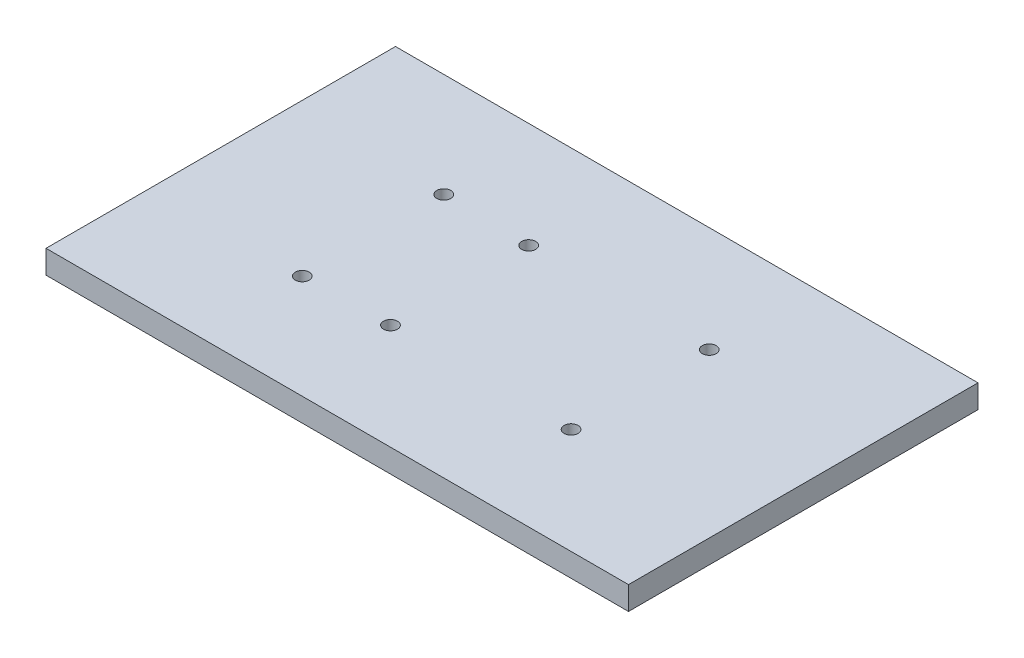
ISO-10303-21;
HEADER;
FILE_DESCRIPTION(('STEP AP214'),'2;1');
FILE_NAME('part.step','',(''),(''),'','','');
FILE_SCHEMA(('AUTOMOTIVE_DESIGN { 1 0 10303 214 1 1 1 1 }'));
ENDSEC;
DATA;
#1=APPLICATION_CONTEXT('core data for automotive mechanical design processes');
#2=APPLICATION_PROTOCOL_DEFINITION('international standard','automotive_design',2000,#1);
#3=PRODUCT_CONTEXT('',#1,'mechanical');
#4=PRODUCT('Part','Part','',(#3));
#5=PRODUCT_RELATED_PRODUCT_CATEGORY('part','',(#4));
#6=PRODUCT_DEFINITION_FORMATION('','',#4);
#7=PRODUCT_DEFINITION_CONTEXT('part definition',#1,'design');
#8=PRODUCT_DEFINITION('design','',#6,#7);
#9=PRODUCT_DEFINITION_SHAPE('','',#8);
#10=(LENGTH_UNIT() NAMED_UNIT(*) SI_UNIT(.MILLI.,.METRE.));
#11=(NAMED_UNIT(*) PLANE_ANGLE_UNIT() SI_UNIT($,.RADIAN.));
#12=(NAMED_UNIT(*) SI_UNIT($,.STERADIAN.) SOLID_ANGLE_UNIT());
#13=UNCERTAINTY_MEASURE_WITH_UNIT(LENGTH_MEASURE(1.E-05),#10,'distance_accuracy_value','');
#14=(GEOMETRIC_REPRESENTATION_CONTEXT(3) GLOBAL_UNCERTAINTY_ASSIGNED_CONTEXT((#13)) GLOBAL_UNIT_ASSIGNED_CONTEXT((#10,
#11,#12)) REPRESENTATION_CONTEXT('',''));
#15=CARTESIAN_POINT('',(0.,0.,0.));
#16=DIRECTION('',(0.,0.,1.));
#17=DIRECTION('',(1.,0.,0.));
#18=AXIS2_PLACEMENT_3D('',#15,#16,#17);
#19=CARTESIAN_POINT('',(0.,5.08,0.));
#20=DIRECTION('',(0.,1.,0.));
#21=DIRECTION('',(0.,0.,1.));
#22=AXIS2_PLACEMENT_3D('',#19,#20,#21);
#23=PLANE('',#22);
#24=DIRECTION('',(1.,0.,0.));
#25=VECTOR('',#24,1.);
#26=CARTESIAN_POINT('',(-63.5,5.08,-38.1));
#27=LINE('',#26,#25);
#28=CARTESIAN_POINT('',(-63.5,5.08,-38.1));
#29=VERTEX_POINT('',#28);
#30=CARTESIAN_POINT('',(63.5,5.08,-38.1));
#31=VERTEX_POINT('',#30);
#32=EDGE_CURVE('E95',#29,#31,#27,.T.);
#33=ORIENTED_EDGE('',*,*,#32,.F.);
#34=DIRECTION('',(0.,0.,-1.));
#35=VECTOR('',#34,1.);
#36=CARTESIAN_POINT('',(-63.5,5.08,38.1));
#37=LINE('',#36,#35);
#38=CARTESIAN_POINT('',(-63.5,5.08,38.1));
#39=VERTEX_POINT('',#38);
#40=EDGE_CURVE('E83',#39,#29,#37,.T.);
#41=ORIENTED_EDGE('',*,*,#40,.F.);
#42=DIRECTION('',(1.,0.,0.));
#43=VECTOR('',#42,1.);
#44=CARTESIAN_POINT('',(-63.5,5.08,38.1));
#45=LINE('',#44,#43);
#46=CARTESIAN_POINT('',(63.5,5.08,38.1));
#47=VERTEX_POINT('',#46);
#48=EDGE_CURVE('E80',#39,#47,#45,.T.);
#49=ORIENTED_EDGE('',*,*,#48,.T.);
#50=DIRECTION('',(0.,0.,-1.));
#51=VECTOR('',#50,1.);
#52=CARTESIAN_POINT('',(63.5,5.08,38.1));
#53=LINE('',#52,#51);
#54=EDGE_CURVE('E77',#47,#31,#53,.T.);
#55=ORIENTED_EDGE('',*,*,#54,.T.);
#56=EDGE_LOOP('',(#33,#41,#49,#55));
#57=FACE_BOUND('',#56,.T.);
#58=CARTESIAN_POINT('',(27.94,5.08,-15.0622));
#59=DIRECTION('',(0.,1.,0.));
#60=DIRECTION('',(0.,0.,1.));
#61=AXIS2_PLACEMENT_3D('',#58,#59,#60);
#62=CIRCLE('',#61,1.524);
#63=CARTESIAN_POINT('',(27.94,5.08,-13.5382));
#64=VERTEX_POINT('',#63);
#65=EDGE_CURVE('E106',#64,#64,#62,.T.);
#66=ORIENTED_EDGE('',*,*,#65,.F.);
#67=EDGE_LOOP('',(#66));
#68=FACE_BOUND('',#67,.T.);
#69=CARTESIAN_POINT('',(-30.3022,5.08,-15.4263161575946));
#70=DIRECTION('',(0.,1.,0.));
#71=DIRECTION('',(0.,0.,1.));
#72=AXIS2_PLACEMENT_3D('',#69,#70,#71);
#73=CIRCLE('',#72,1.524);
#74=CARTESIAN_POINT('',(-30.3022,5.08,-13.9023161575946));
#75=VERTEX_POINT('',#74);
#76=EDGE_CURVE('E205',#75,#75,#73,.T.);
#77=ORIENTED_EDGE('',*,*,#76,.F.);
#78=EDGE_LOOP('',(#77));
#79=FACE_BOUND('',#78,.T.);
#80=CARTESIAN_POINT('',(27.94,5.08,15.0622));
#81=DIRECTION('',(0.,1.,0.));
#82=DIRECTION('',(0.,0.,1.));
#83=AXIS2_PLACEMENT_3D('',#80,#81,#82);
#84=CIRCLE('',#83,1.524);
#85=CARTESIAN_POINT('',(27.94,5.08,16.5862));
#86=VERTEX_POINT('',#85);
#87=EDGE_CURVE('E216',#86,#86,#84,.T.);
#88=ORIENTED_EDGE('',*,*,#87,.F.);
#89=EDGE_LOOP('',(#88));
#90=FACE_BOUND('',#89,.T.);
#91=CARTESIAN_POINT('',(-11.43,5.08,-15.0622));
#92=DIRECTION('',(0.,1.,0.));
#93=DIRECTION('',(0.,0.,1.));
#94=AXIS2_PLACEMENT_3D('',#91,#92,#93);
#95=CIRCLE('',#94,1.524);
#96=CARTESIAN_POINT('',(-11.43,5.08,-13.5382));
#97=VERTEX_POINT('',#96);
#98=EDGE_CURVE('E214',#97,#97,#95,.T.);
#99=ORIENTED_EDGE('',*,*,#98,.F.);
#100=EDGE_LOOP('',(#99));
#101=FACE_BOUND('',#100,.T.);
#102=CARTESIAN_POINT('',(-11.43,5.08,15.0622));
#103=DIRECTION('',(0.,1.,0.));
#104=DIRECTION('',(0.,0.,1.));
#105=AXIS2_PLACEMENT_3D('',#102,#103,#104);
#106=CIRCLE('',#105,1.524);
#107=CARTESIAN_POINT('',(-11.43,5.08,16.5862));
#108=VERTEX_POINT('',#107);
#109=EDGE_CURVE('E210',#108,#108,#106,.T.);
#110=ORIENTED_EDGE('',*,*,#109,.F.);
#111=EDGE_LOOP('',(#110));
#112=FACE_BOUND('',#111,.T.);
#113=CARTESIAN_POINT('',(-30.3022,5.08,15.4263161575946));
#114=DIRECTION('',(0.,-1.,0.));
#115=DIRECTION('',(0.,0.,-1.));
#116=AXIS2_PLACEMENT_3D('',#113,#114,#115);
#117=CIRCLE('',#116,1.524);
#118=CARTESIAN_POINT('',(-30.3022,5.08,13.9023161575946));
#119=VERTEX_POINT('',#118);
#120=EDGE_CURVE('E207',#119,#119,#117,.T.);
#121=ORIENTED_EDGE('',*,*,#120,.T.);
#122=EDGE_LOOP('',(#121));
#123=FACE_BOUND('',#122,.T.);
#124=ADVANCED_FACE('F33',(#57,#68,#79,#90,#101,#112,#123),#23,.T.);
#125=CARTESIAN_POINT('',(0.,0.,0.));
#126=DIRECTION('',(0.,1.,0.));
#127=DIRECTION('',(0.,0.,1.));
#128=AXIS2_PLACEMENT_3D('',#125,#126,#127);
#129=PLANE('',#128);
#130=CARTESIAN_POINT('',(-30.3022,0.,15.4263161575946));
#131=DIRECTION('',(0.,1.,0.));
#132=DIRECTION('',(0.,0.,1.));
#133=AXIS2_PLACEMENT_3D('',#130,#131,#132);
#134=CIRCLE('',#133,1.77800000000002);
#135=CARTESIAN_POINT('',(-30.3022,0.,17.2043161575947));
#136=VERTEX_POINT('',#135);
#137=EDGE_CURVE('E132',#136,#136,#134,.T.);
#138=ORIENTED_EDGE('',*,*,#137,.T.);
#139=EDGE_LOOP('',(#138));
#140=FACE_BOUND('',#139,.T.);
#141=CARTESIAN_POINT('',(-30.3022,0.,-15.4263161575946));
#142=DIRECTION('',(0.,1.,0.));
#143=DIRECTION('',(0.,0.,1.));
#144=AXIS2_PLACEMENT_3D('',#141,#142,#143);
#145=CIRCLE('',#144,1.778);
#146=CARTESIAN_POINT('',(-30.3022,0.,-13.6483161575946));
#147=VERTEX_POINT('',#146);
#148=EDGE_CURVE('E129',#147,#147,#145,.T.);
#149=ORIENTED_EDGE('',*,*,#148,.T.);
#150=EDGE_LOOP('',(#149));
#151=FACE_BOUND('',#150,.T.);
#152=CARTESIAN_POINT('',(-11.43,0.,-15.0622));
#153=DIRECTION('',(0.,1.,0.));
#154=DIRECTION('',(0.,0.,1.));
#155=AXIS2_PLACEMENT_3D('',#152,#153,#154);
#156=CIRCLE('',#155,1.77800000000003);
#157=CARTESIAN_POINT('',(-11.43,0.,-13.2842));
#158=VERTEX_POINT('',#157);
#159=EDGE_CURVE('E126',#158,#158,#156,.T.);
#160=ORIENTED_EDGE('',*,*,#159,.T.);
#161=EDGE_LOOP('',(#160));
#162=FACE_BOUND('',#161,.T.);
#163=CARTESIAN_POINT('',(-11.43,0.,15.0622));
#164=DIRECTION('',(0.,1.,0.));
#165=DIRECTION('',(0.,0.,1.));
#166=AXIS2_PLACEMENT_3D('',#163,#164,#165);
#167=CIRCLE('',#166,1.778);
#168=CARTESIAN_POINT('',(-11.43,0.,16.8402));
#169=VERTEX_POINT('',#168);
#170=EDGE_CURVE('E123',#169,#169,#167,.T.);
#171=ORIENTED_EDGE('',*,*,#170,.T.);
#172=EDGE_LOOP('',(#171));
#173=FACE_BOUND('',#172,.T.);
#174=CARTESIAN_POINT('',(27.94,0.,15.0622));
#175=DIRECTION('',(0.,1.,0.));
#176=DIRECTION('',(0.,0.,1.));
#177=AXIS2_PLACEMENT_3D('',#174,#175,#176);
#178=CIRCLE('',#177,1.77800000000005);
#179=CARTESIAN_POINT('',(27.94,0.,16.8402000000001));
#180=VERTEX_POINT('',#179);
#181=EDGE_CURVE('E120',#180,#180,#178,.T.);
#182=ORIENTED_EDGE('',*,*,#181,.T.);
#183=EDGE_LOOP('',(#182));
#184=FACE_BOUND('',#183,.T.);
#185=CARTESIAN_POINT('',(27.94,0.,-15.0622));
#186=DIRECTION('',(0.,1.,0.));
#187=DIRECTION('',(0.,0.,1.));
#188=AXIS2_PLACEMENT_3D('',#185,#186,#187);
#189=CIRCLE('',#188,1.778);
#190=CARTESIAN_POINT('',(27.94,0.,-13.2842));
#191=VERTEX_POINT('',#190);
#192=EDGE_CURVE('E117',#191,#191,#189,.T.);
#193=ORIENTED_EDGE('',*,*,#192,.T.);
#194=EDGE_LOOP('',(#193));
#195=FACE_BOUND('',#194,.T.);
#196=DIRECTION('',(1.,0.,0.));
#197=VECTOR('',#196,1.);
#198=CARTESIAN_POINT('',(-63.5,0.,-38.1));
#199=LINE('',#198,#197);
#200=CARTESIAN_POINT('',(-63.5,0.,-38.1));
#201=VERTEX_POINT('',#200);
#202=CARTESIAN_POINT('',(63.5,0.,-38.1));
#203=VERTEX_POINT('',#202);
#204=EDGE_CURVE('E102',#201,#203,#199,.T.);
#205=ORIENTED_EDGE('',*,*,#204,.T.);
#206=DIRECTION('',(0.,0.,-1.));
#207=VECTOR('',#206,1.);
#208=CARTESIAN_POINT('',(63.5,0.,38.1));
#209=LINE('',#208,#207);
#210=CARTESIAN_POINT('',(63.5,0.,38.1));
#211=VERTEX_POINT('',#210);
#212=EDGE_CURVE('E105',#211,#203,#209,.T.);
#213=ORIENTED_EDGE('',*,*,#212,.F.);
#214=DIRECTION('',(1.,0.,0.));
#215=VECTOR('',#214,1.);
#216=CARTESIAN_POINT('',(-63.5,0.,38.1));
#217=LINE('',#216,#215);
#218=CARTESIAN_POINT('',(-63.5,0.,38.1));
#219=VERTEX_POINT('',#218);
#220=EDGE_CURVE('E88',#219,#211,#217,.T.);
#221=ORIENTED_EDGE('',*,*,#220,.F.);
#222=DIRECTION('',(0.,0.,-1.));
#223=VECTOR('',#222,1.);
#224=CARTESIAN_POINT('',(-63.5,0.,38.1));
#225=LINE('',#224,#223);
#226=EDGE_CURVE('E97',#219,#201,#225,.T.);
#227=ORIENTED_EDGE('',*,*,#226,.T.);
#228=EDGE_LOOP('',(#205,#213,#221,#227));
#229=FACE_BOUND('',#228,.T.);
#230=ADVANCED_FACE('F155',(#140,#151,#162,#173,#184,#195,#229),#129,.F.);
#231=CARTESIAN_POINT('',(-63.5,5.08,-38.1));
#232=DIRECTION('',(0.,0.,-1.));
#233=DIRECTION('',(-1.,0.,0.));
#234=AXIS2_PLACEMENT_3D('',#231,#232,#233);
#235=PLANE('',#234);
#236=ORIENTED_EDGE('',*,*,#204,.F.);
#237=DIRECTION('',(0.,-1.,0.));
#238=VECTOR('',#237,1.);
#239=CARTESIAN_POINT('',(-63.5,5.08,-38.1));
#240=LINE('',#239,#238);
#241=EDGE_CURVE('E50',#29,#201,#240,.T.);
#242=ORIENTED_EDGE('',*,*,#241,.F.);
#243=ORIENTED_EDGE('',*,*,#32,.T.);
#244=DIRECTION('',(0.,-1.,0.));
#245=VECTOR('',#244,1.);
#246=CARTESIAN_POINT('',(63.5,5.08,-38.1));
#247=LINE('',#246,#245);
#248=EDGE_CURVE('E92',#31,#203,#247,.T.);
#249=ORIENTED_EDGE('',*,*,#248,.T.);
#250=EDGE_LOOP('',(#236,#242,#243,#249));
#251=FACE_BOUND('',#250,.T.);
#252=ADVANCED_FACE('F158',(#251),#235,.T.);
#253=CARTESIAN_POINT('',(-63.5,5.08,38.1));
#254=DIRECTION('',(-1.,0.,0.));
#255=DIRECTION('',(0.,0.,1.));
#256=AXIS2_PLACEMENT_3D('',#253,#254,#255);
#257=PLANE('',#256);
#258=ORIENTED_EDGE('',*,*,#226,.F.);
#259=DIRECTION('',(0.,-1.,0.));
#260=VECTOR('',#259,1.);
#261=CARTESIAN_POINT('',(-63.5,5.08,38.1));
#262=LINE('',#261,#260);
#263=EDGE_CURVE('E66',#39,#219,#262,.T.);
#264=ORIENTED_EDGE('',*,*,#263,.F.);
#265=ORIENTED_EDGE('',*,*,#40,.T.);
#266=ORIENTED_EDGE('',*,*,#241,.T.);
#267=EDGE_LOOP('',(#258,#264,#265,#266));
#268=FACE_BOUND('',#267,.T.);
#269=ADVANCED_FACE('F163',(#268),#257,.T.);
#270=CARTESIAN_POINT('',(-63.5,5.08,38.1));
#271=DIRECTION('',(0.,0.,-1.));
#272=DIRECTION('',(-1.,0.,0.));
#273=AXIS2_PLACEMENT_3D('',#270,#271,#272);
#274=PLANE('',#273);
#275=ORIENTED_EDGE('',*,*,#220,.T.);
#276=DIRECTION('',(0.,-1.,0.));
#277=VECTOR('',#276,1.);
#278=CARTESIAN_POINT('',(63.5,5.08,38.1));
#279=LINE('',#278,#277);
#280=EDGE_CURVE('E86',#47,#211,#279,.T.);
#281=ORIENTED_EDGE('',*,*,#280,.F.);
#282=ORIENTED_EDGE('',*,*,#48,.F.);
#283=ORIENTED_EDGE('',*,*,#263,.T.);
#284=EDGE_LOOP('',(#275,#281,#282,#283));
#285=FACE_BOUND('',#284,.T.);
#286=ADVANCED_FACE('F87',(#285),#274,.F.);
#287=CARTESIAN_POINT('',(63.5,5.08,38.1));
#288=DIRECTION('',(-1.,0.,0.));
#289=DIRECTION('',(0.,0.,1.));
#290=AXIS2_PLACEMENT_3D('',#287,#288,#289);
#291=PLANE('',#290);
#292=ORIENTED_EDGE('',*,*,#212,.T.);
#293=ORIENTED_EDGE('',*,*,#248,.F.);
#294=ORIENTED_EDGE('',*,*,#54,.F.);
#295=ORIENTED_EDGE('',*,*,#280,.T.);
#296=EDGE_LOOP('',(#292,#293,#294,#295));
#297=FACE_BOUND('',#296,.T.);
#298=ADVANCED_FACE('F94',(#297),#291,.F.);
#299=CARTESIAN_POINT('',(27.94,0.,-15.0622));
#300=DIRECTION('',(0.,1.,0.));
#301=DIRECTION('',(0.,0.,1.));
#302=AXIS2_PLACEMENT_3D('',#299,#300,#301);
#303=CYLINDRICAL_SURFACE('',#302,1.524);
#304=CARTESIAN_POINT('',(27.94,0.253999999999978,-15.0622));
#305=DIRECTION('',(0.,1.,0.));
#306=DIRECTION('',(0.,0.,1.));
#307=AXIS2_PLACEMENT_3D('',#304,#305,#306);
#308=CIRCLE('',#307,1.524);
#309=CARTESIAN_POINT('',(27.94,0.253999999999978,-13.5382));
#310=VERTEX_POINT('',#309);
#311=EDGE_CURVE('E11',#310,#310,#308,.F.);
#312=ORIENTED_EDGE('',*,*,#311,.T.);
#313=EDGE_LOOP('',(#312));
#314=FACE_BOUND('',#313,.T.);
#315=ORIENTED_EDGE('',*,*,#65,.T.);
#316=EDGE_LOOP('',(#315));
#317=FACE_BOUND('',#316,.T.);
#318=ADVANCED_FACE('F177',(#314,#317),#303,.F.);
#319=CARTESIAN_POINT('',(-30.3022,0.,-15.4263161575946));
#320=DIRECTION('',(0.,1.,0.));
#321=DIRECTION('',(0.,0.,1.));
#322=AXIS2_PLACEMENT_3D('',#319,#320,#321);
#323=CYLINDRICAL_SURFACE('',#322,1.524);
#324=CARTESIAN_POINT('',(-30.3022,0.253999999999977,-15.4263161575946));
#325=DIRECTION('',(0.,1.,0.));
#326=DIRECTION('',(0.,0.,1.));
#327=AXIS2_PLACEMENT_3D('',#324,#325,#326);
#328=CIRCLE('',#327,1.524);
#329=CARTESIAN_POINT('',(-30.3022,0.253999999999977,-13.9023161575946));
#330=VERTEX_POINT('',#329);
#331=EDGE_CURVE('E135',#330,#330,#328,.F.);
#332=ORIENTED_EDGE('',*,*,#331,.T.);
#333=EDGE_LOOP('',(#332));
#334=FACE_BOUND('',#333,.T.);
#335=ORIENTED_EDGE('',*,*,#76,.T.);
#336=EDGE_LOOP('',(#335));
#337=FACE_BOUND('',#336,.T.);
#338=ADVANCED_FACE('F180',(#334,#337),#323,.F.);
#339=CARTESIAN_POINT('',(27.94,0.,15.0622));
#340=DIRECTION('',(0.,1.,0.));
#341=DIRECTION('',(0.,0.,1.));
#342=AXIS2_PLACEMENT_3D('',#339,#340,#341);
#343=CYLINDRICAL_SURFACE('',#342,1.524);
#344=CARTESIAN_POINT('',(27.94,0.25400000000004,15.0622));
#345=DIRECTION('',(0.,1.,0.));
#346=DIRECTION('',(0.,0.,1.));
#347=AXIS2_PLACEMENT_3D('',#344,#345,#346);
#348=CIRCLE('',#347,1.524);
#349=CARTESIAN_POINT('',(27.94,0.25400000000004,16.5862));
#350=VERTEX_POINT('',#349);
#351=EDGE_CURVE('E42',#350,#350,#348,.F.);
#352=ORIENTED_EDGE('',*,*,#351,.T.);
#353=EDGE_LOOP('',(#352));
#354=FACE_BOUND('',#353,.T.);
#355=ORIENTED_EDGE('',*,*,#87,.T.);
#356=EDGE_LOOP('',(#355));
#357=FACE_BOUND('',#356,.T.);
#358=ADVANCED_FACE('F146',(#354,#357),#343,.F.);
#359=CARTESIAN_POINT('',(-11.43,0.,-15.0622));
#360=DIRECTION('',(0.,1.,0.));
#361=DIRECTION('',(0.,0.,1.));
#362=AXIS2_PLACEMENT_3D('',#359,#360,#361);
#363=CYLINDRICAL_SURFACE('',#362,1.524);
#364=CARTESIAN_POINT('',(-11.43,0.254000000000021,-15.0622));
#365=DIRECTION('',(0.,1.,0.));
#366=DIRECTION('',(0.,0.,1.));
#367=AXIS2_PLACEMENT_3D('',#364,#365,#366);
#368=CIRCLE('',#367,1.524);
#369=CARTESIAN_POINT('',(-11.43,0.254000000000021,-13.5382));
#370=VERTEX_POINT('',#369);
#371=EDGE_CURVE('E138',#370,#370,#368,.F.);
#372=ORIENTED_EDGE('',*,*,#371,.T.);
#373=EDGE_LOOP('',(#372));
#374=FACE_BOUND('',#373,.T.);
#375=ORIENTED_EDGE('',*,*,#98,.T.);
#376=EDGE_LOOP('',(#375));
#377=FACE_BOUND('',#376,.T.);
#378=ADVANCED_FACE('F182',(#374,#377),#363,.F.);
#379=CARTESIAN_POINT('',(-11.43,0.,15.0622));
#380=DIRECTION('',(0.,1.,0.));
#381=DIRECTION('',(0.,0.,1.));
#382=AXIS2_PLACEMENT_3D('',#379,#380,#381);
#383=CYLINDRICAL_SURFACE('',#382,1.524);
#384=CARTESIAN_POINT('',(-11.43,0.254000000000014,15.0622));
#385=DIRECTION('',(0.,1.,0.));
#386=DIRECTION('',(0.,0.,1.));
#387=AXIS2_PLACEMENT_3D('',#384,#385,#386);
#388=CIRCLE('',#387,1.524);
#389=CARTESIAN_POINT('',(-11.43,0.254000000000014,16.5862));
#390=VERTEX_POINT('',#389);
#391=EDGE_CURVE('E141',#390,#390,#388,.F.);
#392=ORIENTED_EDGE('',*,*,#391,.T.);
#393=EDGE_LOOP('',(#392));
#394=FACE_BOUND('',#393,.T.);
#395=ORIENTED_EDGE('',*,*,#109,.T.);
#396=EDGE_LOOP('',(#395));
#397=FACE_BOUND('',#396,.T.);
#398=ADVANCED_FACE('F185',(#394,#397),#383,.F.);
#399=CARTESIAN_POINT('',(-30.3022,0.,15.4263161575946));
#400=DIRECTION('',(0.,1.,0.));
#401=DIRECTION('',(0.,0.,1.));
#402=AXIS2_PLACEMENT_3D('',#399,#400,#401);
#403=CYLINDRICAL_SURFACE('',#402,1.524);
#404=CARTESIAN_POINT('',(-30.3022,0.254000000000018,15.4263161575946));
#405=DIRECTION('',(0.,1.,0.));
#406=DIRECTION('',(0.,0.,1.));
#407=AXIS2_PLACEMENT_3D('',#404,#405,#406);
#408=CIRCLE('',#407,1.524);
#409=CARTESIAN_POINT('',(-30.3022,0.254000000000018,16.9503161575946));
#410=VERTEX_POINT('',#409);
#411=EDGE_CURVE('E112',#410,#410,#408,.F.);
#412=ORIENTED_EDGE('',*,*,#411,.T.);
#413=EDGE_LOOP('',(#412));
#414=FACE_BOUND('',#413,.T.);
#415=ORIENTED_EDGE('',*,*,#120,.F.);
#416=EDGE_LOOP('',(#415));
#417=FACE_BOUND('',#416,.T.);
#418=ADVANCED_FACE('F189',(#414,#417),#403,.F.);
#419=CARTESIAN_POINT('',(-30.3022,0.254000000000019,15.4263161575946));
#420=DIRECTION('',(0.,-1.,0.));
#421=DIRECTION('',(0.,0.,-1.));
#422=AXIS2_PLACEMENT_3D('',#419,#420,#421);
#423=CONICAL_SURFACE('',#422,1.524,0.785398163397441);
#424=ORIENTED_EDGE('',*,*,#137,.F.);
#425=EDGE_LOOP('',(#424));
#426=FACE_BOUND('',#425,.T.);
#427=ORIENTED_EDGE('',*,*,#411,.F.);
#428=EDGE_LOOP('',(#427));
#429=FACE_BOUND('',#428,.T.);
#430=ADVANCED_FACE('F192',(#426,#429),#423,.F.);
#431=CARTESIAN_POINT('',(-30.3022,0.,-15.4263161575946));
#432=DIRECTION('',(0.,-1.,0.));
#433=DIRECTION('',(0.,0.,-1.));
#434=AXIS2_PLACEMENT_3D('',#431,#432,#433);
#435=CONICAL_SURFACE('',#434,1.778,0.785398163397496);
#436=ORIENTED_EDGE('',*,*,#331,.F.);
#437=EDGE_LOOP('',(#436));
#438=FACE_BOUND('',#437,.T.);
#439=ORIENTED_EDGE('',*,*,#148,.F.);
#440=EDGE_LOOP('',(#439));
#441=FACE_BOUND('',#440,.T.);
#442=ADVANCED_FACE('F235',(#438,#441),#435,.F.);
#443=CARTESIAN_POINT('',(-11.43,0.,-15.0622));
#444=DIRECTION('',(0.,-1.,0.));
#445=DIRECTION('',(0.,0.,-1.));
#446=AXIS2_PLACEMENT_3D('',#443,#444,#445);
#447=CONICAL_SURFACE('',#446,1.77800000000003,0.785398163397465);
#448=ORIENTED_EDGE('',*,*,#371,.F.);
#449=EDGE_LOOP('',(#448));
#450=FACE_BOUND('',#449,.T.);
#451=ORIENTED_EDGE('',*,*,#159,.F.);
#452=EDGE_LOOP('',(#451));
#453=FACE_BOUND('',#452,.T.);
#454=ADVANCED_FACE('F238',(#450,#453),#447,.F.);
#455=CARTESIAN_POINT('',(-11.43,0.,15.0622));
#456=DIRECTION('',(0.,-1.,0.));
#457=DIRECTION('',(0.,0.,-1.));
#458=AXIS2_PLACEMENT_3D('',#455,#456,#457);
#459=CONICAL_SURFACE('',#458,1.778,0.785398163397424);
#460=ORIENTED_EDGE('',*,*,#391,.F.);
#461=EDGE_LOOP('',(#460));
#462=FACE_BOUND('',#461,.T.);
#463=ORIENTED_EDGE('',*,*,#170,.F.);
#464=EDGE_LOOP('',(#463));
#465=FACE_BOUND('',#464,.T.);
#466=ADVANCED_FACE('F152',(#462,#465),#459,.F.);
#467=CARTESIAN_POINT('',(27.94,0.,15.0622));
#468=DIRECTION('',(0.,-1.,0.));
#469=DIRECTION('',(0.,0.,-1.));
#470=AXIS2_PLACEMENT_3D('',#467,#468,#469);
#471=CONICAL_SURFACE('',#470,1.77800000000005,0.785398163397455);
#472=ORIENTED_EDGE('',*,*,#351,.F.);
#473=EDGE_LOOP('',(#472));
#474=FACE_BOUND('',#473,.T.);
#475=ORIENTED_EDGE('',*,*,#181,.F.);
#476=EDGE_LOOP('',(#475));
#477=FACE_BOUND('',#476,.T.);
#478=ADVANCED_FACE('F149',(#474,#477),#471,.F.);
#479=CARTESIAN_POINT('',(27.94,0.,-15.0622));
#480=DIRECTION('',(0.,-1.,0.));
#481=DIRECTION('',(0.,0.,-1.));
#482=AXIS2_PLACEMENT_3D('',#479,#480,#481);
#483=CONICAL_SURFACE('',#482,1.778,0.785398163397496);
#484=ORIENTED_EDGE('',*,*,#311,.F.);
#485=EDGE_LOOP('',(#484));
#486=FACE_BOUND('',#485,.T.);
#487=ORIENTED_EDGE('',*,*,#192,.F.);
#488=EDGE_LOOP('',(#487));
#489=FACE_BOUND('',#488,.T.);
#490=ADVANCED_FACE('F35',(#486,#489),#483,.F.);
#491=CLOSED_SHELL('',(#124,#230,#252,#269,#286,#298,#318,#338,#358,#378,#398,#418,#430,#442,
#454,#466,#478,#490));
#492=MANIFOLD_SOLID_BREP('B2',#491);
#493=ADVANCED_BREP_SHAPE_REPRESENTATION('',(#18,#492),#14);
#494=SHAPE_DEFINITION_REPRESENTATION(#9,#493);
ENDSEC;
END-ISO-10303-21;
